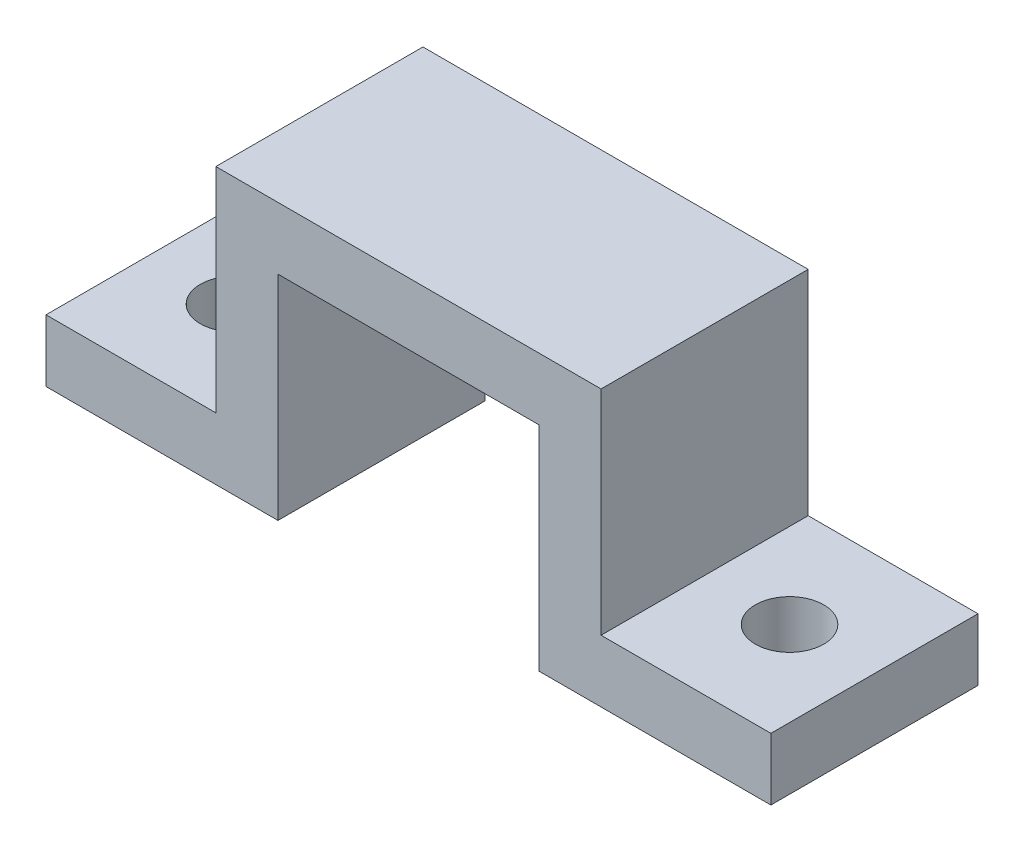
ISO-10303-21;
HEADER;
FILE_DESCRIPTION(('STEP AP214'),'2;1');
FILE_NAME('part.step','',(''),(''),'','','');
FILE_SCHEMA(('AUTOMOTIVE_DESIGN { 1 0 10303 214 1 1 1 1 }'));
ENDSEC;
DATA;
#1=APPLICATION_CONTEXT('core data for automotive mechanical design processes');
#2=APPLICATION_PROTOCOL_DEFINITION('international standard','automotive_design',2000,#1);
#3=PRODUCT_CONTEXT('',#1,'mechanical');
#4=PRODUCT('Part','Part','',(#3));
#5=PRODUCT_RELATED_PRODUCT_CATEGORY('part','',(#4));
#6=PRODUCT_DEFINITION_FORMATION('','',#4);
#7=PRODUCT_DEFINITION_CONTEXT('part definition',#1,'design');
#8=PRODUCT_DEFINITION('design','',#6,#7);
#9=PRODUCT_DEFINITION_SHAPE('','',#8);
#10=(LENGTH_UNIT() NAMED_UNIT(*) SI_UNIT(.MILLI.,.METRE.));
#11=(NAMED_UNIT(*) PLANE_ANGLE_UNIT() SI_UNIT($,.RADIAN.));
#12=(NAMED_UNIT(*) SI_UNIT($,.STERADIAN.) SOLID_ANGLE_UNIT());
#13=UNCERTAINTY_MEASURE_WITH_UNIT(LENGTH_MEASURE(1.E-05),#10,'distance_accuracy_value','');
#14=(GEOMETRIC_REPRESENTATION_CONTEXT(3) GLOBAL_UNCERTAINTY_ASSIGNED_CONTEXT((#13)) GLOBAL_UNIT_ASSIGNED_CONTEXT((#10,
#11,#12)) REPRESENTATION_CONTEXT('',''));
#15=CARTESIAN_POINT('',(0.,0.,0.));
#16=DIRECTION('',(0.,0.,1.));
#17=DIRECTION('',(1.,0.,0.));
#18=AXIS2_PLACEMENT_3D('',#15,#16,#17);
#19=CARTESIAN_POINT('',(0.,-5.15,10.));
#20=DIRECTION('',(0.,-1.,0.));
#21=DIRECTION('',(1.,0.,0.));
#22=AXIS2_PLACEMENT_3D('',#19,#20,#21);
#23=PLANE('',#22);
#24=CARTESIAN_POINT('',(13.4,-5.15,5.));
#25=DIRECTION('',(0.,-1.,0.));
#26=DIRECTION('',(1.,0.,0.));
#27=AXIS2_PLACEMENT_3D('',#24,#25,#26);
#28=CIRCLE('',#27,1.65);
#29=CARTESIAN_POINT('',(15.05,-5.15,5.));
#30=VERTEX_POINT('',#29);
#31=EDGE_CURVE('E251',#30,#30,#28,.F.);
#32=ORIENTED_EDGE('',*,*,#31,.T.);
#33=EDGE_LOOP('',(#32));
#34=FACE_BOUND('',#33,.T.);
#35=DIRECTION('',(-1.,0.,0.));
#36=VECTOR('',#35,1.);
#37=CARTESIAN_POINT('',(0.,-5.15,0.));
#38=LINE('',#37,#36);
#39=CARTESIAN_POINT('',(17.5,-5.15,0.));
#40=VERTEX_POINT('',#39);
#41=CARTESIAN_POINT('',(6.3,-5.15,0.));
#42=VERTEX_POINT('',#41);
#43=EDGE_CURVE('E155',#40,#42,#38,.T.);
#44=ORIENTED_EDGE('',*,*,#43,.F.);
#45=DIRECTION('',(0.,0.,-1.));
#46=VECTOR('',#45,1.);
#47=CARTESIAN_POINT('',(17.5,-5.15,10.));
#48=LINE('',#47,#46);
#49=CARTESIAN_POINT('',(17.5,-5.15,10.));
#50=VERTEX_POINT('',#49);
#51=EDGE_CURVE('E11',#50,#40,#48,.T.);
#52=ORIENTED_EDGE('',*,*,#51,.F.);
#53=DIRECTION('',(-1.,0.,0.));
#54=VECTOR('',#53,1.);
#55=CARTESIAN_POINT('',(0.,-5.15,10.));
#56=LINE('',#55,#54);
#57=CARTESIAN_POINT('',(6.3,-5.15,10.));
#58=VERTEX_POINT('',#57);
#59=EDGE_CURVE('E187',#50,#58,#56,.T.);
#60=ORIENTED_EDGE('',*,*,#59,.T.);
#61=DIRECTION('',(0.,0.,-1.));
#62=VECTOR('',#61,1.);
#63=CARTESIAN_POINT('',(6.3,-5.15,10.));
#64=LINE('',#63,#62);
#65=EDGE_CURVE('E99',#58,#42,#64,.T.);
#66=ORIENTED_EDGE('',*,*,#65,.T.);
#67=EDGE_LOOP('',(#44,#52,#60,#66));
#68=FACE_BOUND('',#67,.T.);
#69=ADVANCED_FACE('F37',(#34,#68),#23,.T.);
#70=CARTESIAN_POINT('',(17.5,0.,10.));
#71=DIRECTION('',(1.,0.,0.));
#72=DIRECTION('',(0.,0.,-1.));
#73=AXIS2_PLACEMENT_3D('',#70,#71,#72);
#74=PLANE('',#73);
#75=DIRECTION('',(0.,-1.,0.));
#76=VECTOR('',#75,1.);
#77=CARTESIAN_POINT('',(17.5,0.,0.));
#78=LINE('',#77,#76);
#79=CARTESIAN_POINT('',(17.5,-2.15,0.));
#80=VERTEX_POINT('',#79);
#81=EDGE_CURVE('E158',#80,#40,#78,.T.);
#82=ORIENTED_EDGE('',*,*,#81,.F.);
#83=DIRECTION('',(0.,0.,-1.));
#84=VECTOR('',#83,1.);
#85=CARTESIAN_POINT('',(17.5,-2.15,10.));
#86=LINE('',#85,#84);
#87=CARTESIAN_POINT('',(17.5,-2.15,10.));
#88=VERTEX_POINT('',#87);
#89=EDGE_CURVE('E45',#88,#80,#86,.T.);
#90=ORIENTED_EDGE('',*,*,#89,.F.);
#91=DIRECTION('',(0.,-1.,0.));
#92=VECTOR('',#91,1.);
#93=CARTESIAN_POINT('',(17.5,0.,10.));
#94=LINE('',#93,#92);
#95=EDGE_CURVE('E224',#88,#50,#94,.T.);
#96=ORIENTED_EDGE('',*,*,#95,.T.);
#97=ORIENTED_EDGE('',*,*,#51,.T.);
#98=EDGE_LOOP('',(#82,#90,#96,#97));
#99=FACE_BOUND('',#98,.T.);
#100=ADVANCED_FACE('F212',(#99),#74,.T.);
#101=CARTESIAN_POINT('',(0.,-2.15,10.));
#102=DIRECTION('',(0.,1.,0.));
#103=DIRECTION('',(0.,0.,1.));
#104=AXIS2_PLACEMENT_3D('',#101,#102,#103);
#105=PLANE('',#104);
#106=CARTESIAN_POINT('',(13.4,-2.15,5.));
#107=DIRECTION('',(0.,1.,0.));
#108=DIRECTION('',(0.,0.,1.));
#109=AXIS2_PLACEMENT_3D('',#106,#107,#108);
#110=CIRCLE('',#109,1.65);
#111=CARTESIAN_POINT('',(13.4,-2.15,6.65));
#112=VERTEX_POINT('',#111);
#113=EDGE_CURVE('E255',#112,#112,#110,.T.);
#114=ORIENTED_EDGE('',*,*,#113,.F.);
#115=EDGE_LOOP('',(#114));
#116=FACE_BOUND('',#115,.T.);
#117=DIRECTION('',(1.,0.,0.));
#118=VECTOR('',#117,1.);
#119=CARTESIAN_POINT('',(0.,-2.15,0.));
#120=LINE('',#119,#118);
#121=CARTESIAN_POINT('',(9.3,-2.15,0.));
#122=VERTEX_POINT('',#121);
#123=EDGE_CURVE('E162',#122,#80,#120,.T.);
#124=ORIENTED_EDGE('',*,*,#123,.F.);
#125=DIRECTION('',(0.,0.,-1.));
#126=VECTOR('',#125,1.);
#127=CARTESIAN_POINT('',(9.3,-2.15,10.));
#128=LINE('',#127,#126);
#129=CARTESIAN_POINT('',(9.3,-2.15,10.));
#130=VERTEX_POINT('',#129);
#131=EDGE_CURVE('E201',#130,#122,#128,.T.);
#132=ORIENTED_EDGE('',*,*,#131,.F.);
#133=DIRECTION('',(1.,0.,0.));
#134=VECTOR('',#133,1.);
#135=CARTESIAN_POINT('',(0.,-2.15,10.));
#136=LINE('',#135,#134);
#137=EDGE_CURVE('E208',#130,#88,#136,.T.);
#138=ORIENTED_EDGE('',*,*,#137,.T.);
#139=ORIENTED_EDGE('',*,*,#89,.T.);
#140=EDGE_LOOP('',(#124,#132,#138,#139));
#141=FACE_BOUND('',#140,.T.);
#142=ADVANCED_FACE('F206',(#116,#141),#105,.T.);
#143=CARTESIAN_POINT('',(9.3,0.,10.));
#144=DIRECTION('',(1.,0.,0.));
#145=DIRECTION('',(0.,0.,-1.));
#146=AXIS2_PLACEMENT_3D('',#143,#144,#145);
#147=PLANE('',#146);
#148=DIRECTION('',(0.,-1.,0.));
#149=VECTOR('',#148,1.);
#150=CARTESIAN_POINT('',(9.3,0.,0.));
#151=LINE('',#150,#149);
#152=CARTESIAN_POINT('',(9.3,8.15,0.));
#153=VERTEX_POINT('',#152);
#154=EDGE_CURVE('E165',#153,#122,#151,.T.);
#155=ORIENTED_EDGE('',*,*,#154,.F.);
#156=DIRECTION('',(0.,0.,-1.));
#157=VECTOR('',#156,1.);
#158=CARTESIAN_POINT('',(9.3,8.15,10.));
#159=LINE('',#158,#157);
#160=CARTESIAN_POINT('',(9.3,8.15,10.));
#161=VERTEX_POINT('',#160);
#162=EDGE_CURVE('E199',#161,#153,#159,.T.);
#163=ORIENTED_EDGE('',*,*,#162,.F.);
#164=DIRECTION('',(0.,-1.,0.));
#165=VECTOR('',#164,1.);
#166=CARTESIAN_POINT('',(9.3,0.,10.));
#167=LINE('',#166,#165);
#168=EDGE_CURVE('E221',#161,#130,#167,.T.);
#169=ORIENTED_EDGE('',*,*,#168,.T.);
#170=ORIENTED_EDGE('',*,*,#131,.T.);
#171=EDGE_LOOP('',(#155,#163,#169,#170));
#172=FACE_BOUND('',#171,.T.);
#173=ADVANCED_FACE('F218',(#172),#147,.T.);
#174=CARTESIAN_POINT('',(0.,8.15,10.));
#175=DIRECTION('',(0.,1.,0.));
#176=DIRECTION('',(0.,0.,1.));
#177=AXIS2_PLACEMENT_3D('',#174,#175,#176);
#178=PLANE('',#177);
#179=DIRECTION('',(1.,0.,0.));
#180=VECTOR('',#179,1.);
#181=CARTESIAN_POINT('',(0.,8.15,0.));
#182=LINE('',#181,#180);
#183=CARTESIAN_POINT('',(-9.3,8.15,0.));
#184=VERTEX_POINT('',#183);
#185=EDGE_CURVE('E168',#184,#153,#182,.T.);
#186=ORIENTED_EDGE('',*,*,#185,.F.);
#187=DIRECTION('',(0.,0.,-1.));
#188=VECTOR('',#187,1.);
#189=CARTESIAN_POINT('',(-9.3,8.15,10.));
#190=LINE('',#189,#188);
#191=CARTESIAN_POINT('',(-9.3,8.15,10.));
#192=VERTEX_POINT('',#191);
#193=EDGE_CURVE('E197',#192,#184,#190,.T.);
#194=ORIENTED_EDGE('',*,*,#193,.F.);
#195=DIRECTION('',(1.,0.,0.));
#196=VECTOR('',#195,1.);
#197=CARTESIAN_POINT('',(0.,8.15,10.));
#198=LINE('',#197,#196);
#199=EDGE_CURVE('E226',#192,#161,#198,.T.);
#200=ORIENTED_EDGE('',*,*,#199,.T.);
#201=ORIENTED_EDGE('',*,*,#162,.T.);
#202=EDGE_LOOP('',(#186,#194,#200,#201));
#203=FACE_BOUND('',#202,.T.);
#204=ADVANCED_FACE('F274',(#203),#178,.T.);
#205=CARTESIAN_POINT('',(-9.3,0.,10.));
#206=DIRECTION('',(-1.,0.,0.));
#207=DIRECTION('',(0.,0.,1.));
#208=AXIS2_PLACEMENT_3D('',#205,#206,#207);
#209=PLANE('',#208);
#210=DIRECTION('',(0.,1.,0.));
#211=VECTOR('',#210,1.);
#212=CARTESIAN_POINT('',(-9.3,0.,0.));
#213=LINE('',#212,#211);
#214=CARTESIAN_POINT('',(-9.3,-2.15,0.));
#215=VERTEX_POINT('',#214);
#216=EDGE_CURVE('E171',#215,#184,#213,.T.);
#217=ORIENTED_EDGE('',*,*,#216,.F.);
#218=DIRECTION('',(0.,0.,-1.));
#219=VECTOR('',#218,1.);
#220=CARTESIAN_POINT('',(-9.3,-2.15,10.));
#221=LINE('',#220,#219);
#222=CARTESIAN_POINT('',(-9.3,-2.15,10.));
#223=VERTEX_POINT('',#222);
#224=EDGE_CURVE('E195',#223,#215,#221,.T.);
#225=ORIENTED_EDGE('',*,*,#224,.F.);
#226=DIRECTION('',(0.,1.,0.));
#227=VECTOR('',#226,1.);
#228=CARTESIAN_POINT('',(-9.3,0.,10.));
#229=LINE('',#228,#227);
#230=EDGE_CURVE('E232',#223,#192,#229,.T.);
#231=ORIENTED_EDGE('',*,*,#230,.T.);
#232=ORIENTED_EDGE('',*,*,#193,.T.);
#233=EDGE_LOOP('',(#217,#225,#231,#232));
#234=FACE_BOUND('',#233,.T.);
#235=ADVANCED_FACE('F269',(#234),#209,.T.);
#236=CARTESIAN_POINT('',(0.,-2.15,10.));
#237=DIRECTION('',(0.,1.,0.));
#238=DIRECTION('',(0.,0.,1.));
#239=AXIS2_PLACEMENT_3D('',#236,#237,#238);
#240=PLANE('',#239);
#241=CARTESIAN_POINT('',(-13.4,-2.15,5.));
#242=DIRECTION('',(0.,1.,0.));
#243=DIRECTION('',(0.,0.,1.));
#244=AXIS2_PLACEMENT_3D('',#241,#242,#243);
#245=CIRCLE('',#244,1.65);
#246=CARTESIAN_POINT('',(-13.4,-2.15,6.65));
#247=VERTEX_POINT('',#246);
#248=EDGE_CURVE('E254',#247,#247,#245,.T.);
#249=ORIENTED_EDGE('',*,*,#248,.F.);
#250=EDGE_LOOP('',(#249));
#251=FACE_BOUND('',#250,.T.);
#252=DIRECTION('',(1.,0.,0.));
#253=VECTOR('',#252,1.);
#254=CARTESIAN_POINT('',(0.,-2.15,0.));
#255=LINE('',#254,#253);
#256=CARTESIAN_POINT('',(-17.5,-2.15,0.));
#257=VERTEX_POINT('',#256);
#258=EDGE_CURVE('E174',#257,#215,#255,.T.);
#259=ORIENTED_EDGE('',*,*,#258,.F.);
#260=DIRECTION('',(0.,0.,-1.));
#261=VECTOR('',#260,1.);
#262=CARTESIAN_POINT('',(-17.5,-2.15,10.));
#263=LINE('',#262,#261);
#264=CARTESIAN_POINT('',(-17.5,-2.15,10.));
#265=VERTEX_POINT('',#264);
#266=EDGE_CURVE('E193',#265,#257,#263,.T.);
#267=ORIENTED_EDGE('',*,*,#266,.F.);
#268=DIRECTION('',(1.,0.,0.));
#269=VECTOR('',#268,1.);
#270=CARTESIAN_POINT('',(0.,-2.15,10.));
#271=LINE('',#270,#269);
#272=EDGE_CURVE('E235',#265,#223,#271,.T.);
#273=ORIENTED_EDGE('',*,*,#272,.T.);
#274=ORIENTED_EDGE('',*,*,#224,.T.);
#275=EDGE_LOOP('',(#259,#267,#273,#274));
#276=FACE_BOUND('',#275,.T.);
#277=ADVANCED_FACE('F266',(#251,#276),#240,.T.);
#278=CARTESIAN_POINT('',(-17.5,0.,10.));
#279=DIRECTION('',(-1.,0.,0.));
#280=DIRECTION('',(0.,0.,1.));
#281=AXIS2_PLACEMENT_3D('',#278,#279,#280);
#282=PLANE('',#281);
#283=DIRECTION('',(0.,1.,0.));
#284=VECTOR('',#283,1.);
#285=CARTESIAN_POINT('',(-17.5,0.,0.));
#286=LINE('',#285,#284);
#287=CARTESIAN_POINT('',(-17.5,-5.15,0.));
#288=VERTEX_POINT('',#287);
#289=EDGE_CURVE('E177',#288,#257,#286,.T.);
#290=ORIENTED_EDGE('',*,*,#289,.F.);
#291=DIRECTION('',(0.,0.,-1.));
#292=VECTOR('',#291,1.);
#293=CARTESIAN_POINT('',(-17.5,-5.15,10.));
#294=LINE('',#293,#292);
#295=CARTESIAN_POINT('',(-17.5,-5.15,10.));
#296=VERTEX_POINT('',#295);
#297=EDGE_CURVE('E191',#296,#288,#294,.T.);
#298=ORIENTED_EDGE('',*,*,#297,.F.);
#299=DIRECTION('',(0.,1.,0.));
#300=VECTOR('',#299,1.);
#301=CARTESIAN_POINT('',(-17.5,0.,10.));
#302=LINE('',#301,#300);
#303=EDGE_CURVE('E150',#296,#265,#302,.T.);
#304=ORIENTED_EDGE('',*,*,#303,.T.);
#305=ORIENTED_EDGE('',*,*,#266,.T.);
#306=EDGE_LOOP('',(#290,#298,#304,#305));
#307=FACE_BOUND('',#306,.T.);
#308=ADVANCED_FACE('F240',(#307),#282,.T.);
#309=CARTESIAN_POINT('',(0.,-5.15,10.));
#310=DIRECTION('',(0.,-1.,0.));
#311=DIRECTION('',(1.,0.,0.));
#312=AXIS2_PLACEMENT_3D('',#309,#310,#311);
#313=PLANE('',#312);
#314=CARTESIAN_POINT('',(-13.4,-5.15,5.));
#315=DIRECTION('',(0.,-1.,0.));
#316=DIRECTION('',(1.,0.,0.));
#317=AXIS2_PLACEMENT_3D('',#314,#315,#316);
#318=CIRCLE('',#317,1.65);
#319=CARTESIAN_POINT('',(-11.75,-5.15,5.));
#320=VERTEX_POINT('',#319);
#321=EDGE_CURVE('E159',#320,#320,#318,.F.);
#322=ORIENTED_EDGE('',*,*,#321,.T.);
#323=EDGE_LOOP('',(#322));
#324=FACE_BOUND('',#323,.T.);
#325=DIRECTION('',(-1.,0.,0.));
#326=VECTOR('',#325,1.);
#327=CARTESIAN_POINT('',(0.,-5.15,0.));
#328=LINE('',#327,#326);
#329=CARTESIAN_POINT('',(-6.3,-5.15,0.));
#330=VERTEX_POINT('',#329);
#331=EDGE_CURVE('E180',#330,#288,#328,.T.);
#332=ORIENTED_EDGE('',*,*,#331,.F.);
#333=DIRECTION('',(0.,0.,-1.));
#334=VECTOR('',#333,1.);
#335=CARTESIAN_POINT('',(-6.3,-5.15,10.));
#336=LINE('',#335,#334);
#337=CARTESIAN_POINT('',(-6.3,-5.15,10.));
#338=VERTEX_POINT('',#337);
#339=EDGE_CURVE('E138',#338,#330,#336,.T.);
#340=ORIENTED_EDGE('',*,*,#339,.F.);
#341=DIRECTION('',(-1.,0.,0.));
#342=VECTOR('',#341,1.);
#343=CARTESIAN_POINT('',(0.,-5.15,10.));
#344=LINE('',#343,#342);
#345=EDGE_CURVE('E148',#338,#296,#344,.T.);
#346=ORIENTED_EDGE('',*,*,#345,.T.);
#347=ORIENTED_EDGE('',*,*,#297,.T.);
#348=EDGE_LOOP('',(#332,#340,#346,#347));
#349=FACE_BOUND('',#348,.T.);
#350=ADVANCED_FACE('F246',(#324,#349),#313,.T.);
#351=CARTESIAN_POINT('',(-6.3,0.,10.));
#352=DIRECTION('',(1.,0.,0.));
#353=DIRECTION('',(0.,1.,0.));
#354=AXIS2_PLACEMENT_3D('',#351,#352,#353);
#355=PLANE('',#354);
#356=DIRECTION('',(0.,-1.,0.));
#357=VECTOR('',#356,1.);
#358=CARTESIAN_POINT('',(-6.3,0.,0.));
#359=LINE('',#358,#357);
#360=CARTESIAN_POINT('',(-6.3,5.15,0.));
#361=VERTEX_POINT('',#360);
#362=EDGE_CURVE('E137',#361,#330,#359,.T.);
#363=ORIENTED_EDGE('',*,*,#362,.F.);
#364=DIRECTION('',(0.,0.,-1.));
#365=VECTOR('',#364,1.);
#366=CARTESIAN_POINT('',(-6.3,5.15,10.));
#367=LINE('',#366,#365);
#368=CARTESIAN_POINT('',(-6.3,5.15,10.));
#369=VERTEX_POINT('',#368);
#370=EDGE_CURVE('E131',#369,#361,#367,.T.);
#371=ORIENTED_EDGE('',*,*,#370,.F.);
#372=DIRECTION('',(0.,-1.,0.));
#373=VECTOR('',#372,1.);
#374=CARTESIAN_POINT('',(-6.3,0.,10.));
#375=LINE('',#374,#373);
#376=EDGE_CURVE('E135',#369,#338,#375,.T.);
#377=ORIENTED_EDGE('',*,*,#376,.T.);
#378=ORIENTED_EDGE('',*,*,#339,.T.);
#379=EDGE_LOOP('',(#363,#371,#377,#378));
#380=FACE_BOUND('',#379,.T.);
#381=ADVANCED_FACE('F133',(#380),#355,.T.);
#382=CARTESIAN_POINT('',(0.,5.15,10.));
#383=DIRECTION('',(0.,1.,0.));
#384=DIRECTION('',(0.,0.,1.));
#385=AXIS2_PLACEMENT_3D('',#382,#383,#384);
#386=PLANE('',#385);
#387=DIRECTION('',(1.,0.,0.));
#388=VECTOR('',#387,1.);
#389=CARTESIAN_POINT('',(0.,5.15,0.));
#390=LINE('',#389,#388);
#391=CARTESIAN_POINT('',(6.3,5.15,0.));
#392=VERTEX_POINT('',#391);
#393=EDGE_CURVE('E92',#361,#392,#390,.T.);
#394=ORIENTED_EDGE('',*,*,#393,.T.);
#395=DIRECTION('',(0.,0.,-1.));
#396=VECTOR('',#395,1.);
#397=CARTESIAN_POINT('',(6.3,5.15,10.));
#398=LINE('',#397,#396);
#399=CARTESIAN_POINT('',(6.3,5.15,10.));
#400=VERTEX_POINT('',#399);
#401=EDGE_CURVE('E139',#400,#392,#398,.T.);
#402=ORIENTED_EDGE('',*,*,#401,.F.);
#403=DIRECTION('',(1.,0.,0.));
#404=VECTOR('',#403,1.);
#405=CARTESIAN_POINT('',(0.,5.15,10.));
#406=LINE('',#405,#404);
#407=EDGE_CURVE('E141',#369,#400,#406,.T.);
#408=ORIENTED_EDGE('',*,*,#407,.F.);
#409=ORIENTED_EDGE('',*,*,#370,.T.);
#410=EDGE_LOOP('',(#394,#402,#408,#409));
#411=FACE_BOUND('',#410,.T.);
#412=ADVANCED_FACE('F142',(#411),#386,.F.);
#413=CARTESIAN_POINT('',(6.3,0.,10.));
#414=DIRECTION('',(1.,0.,0.));
#415=DIRECTION('',(0.,1.,0.));
#416=AXIS2_PLACEMENT_3D('',#413,#414,#415);
#417=PLANE('',#416);
#418=DIRECTION('',(0.,-1.,0.));
#419=VECTOR('',#418,1.);
#420=CARTESIAN_POINT('',(6.3,0.,0.));
#421=LINE('',#420,#419);
#422=EDGE_CURVE('E185',#392,#42,#421,.T.);
#423=ORIENTED_EDGE('',*,*,#422,.T.);
#424=ORIENTED_EDGE('',*,*,#65,.F.);
#425=DIRECTION('',(0.,-1.,0.));
#426=VECTOR('',#425,1.);
#427=CARTESIAN_POINT('',(6.3,0.,10.));
#428=LINE('',#427,#426);
#429=EDGE_CURVE('E53',#400,#58,#428,.T.);
#430=ORIENTED_EDGE('',*,*,#429,.F.);
#431=ORIENTED_EDGE('',*,*,#401,.T.);
#432=EDGE_LOOP('',(#423,#424,#430,#431));
#433=FACE_BOUND('',#432,.T.);
#434=ADVANCED_FACE('F249',(#433),#417,.F.);
#435=CARTESIAN_POINT('',(0.,0.,10.));
#436=DIRECTION('',(0.,0.,1.));
#437=DIRECTION('',(1.,0.,0.));
#438=AXIS2_PLACEMENT_3D('',#435,#436,#437);
#439=PLANE('',#438);
#440=ORIENTED_EDGE('',*,*,#59,.F.);
#441=ORIENTED_EDGE('',*,*,#95,.F.);
#442=ORIENTED_EDGE('',*,*,#137,.F.);
#443=ORIENTED_EDGE('',*,*,#168,.F.);
#444=ORIENTED_EDGE('',*,*,#199,.F.);
#445=ORIENTED_EDGE('',*,*,#230,.F.);
#446=ORIENTED_EDGE('',*,*,#272,.F.);
#447=ORIENTED_EDGE('',*,*,#303,.F.);
#448=ORIENTED_EDGE('',*,*,#345,.F.);
#449=ORIENTED_EDGE('',*,*,#376,.F.);
#450=ORIENTED_EDGE('',*,*,#407,.T.);
#451=ORIENTED_EDGE('',*,*,#429,.T.);
#452=EDGE_LOOP('',(#440,#441,#442,#443,#444,#445,#446,#447,#448,#449,#450,#451));
#453=FACE_BOUND('',#452,.T.);
#454=ADVANCED_FACE('F145',(#453),#439,.T.);
#455=CARTESIAN_POINT('',(0.,0.,0.));
#456=DIRECTION('',(0.,0.,1.));
#457=DIRECTION('',(1.,0.,0.));
#458=AXIS2_PLACEMENT_3D('',#455,#456,#457);
#459=PLANE('',#458);
#460=ORIENTED_EDGE('',*,*,#43,.T.);
#461=ORIENTED_EDGE('',*,*,#422,.F.);
#462=ORIENTED_EDGE('',*,*,#393,.F.);
#463=ORIENTED_EDGE('',*,*,#362,.T.);
#464=ORIENTED_EDGE('',*,*,#331,.T.);
#465=ORIENTED_EDGE('',*,*,#289,.T.);
#466=ORIENTED_EDGE('',*,*,#258,.T.);
#467=ORIENTED_EDGE('',*,*,#216,.T.);
#468=ORIENTED_EDGE('',*,*,#185,.T.);
#469=ORIENTED_EDGE('',*,*,#154,.T.);
#470=ORIENTED_EDGE('',*,*,#123,.T.);
#471=ORIENTED_EDGE('',*,*,#81,.T.);
#472=EDGE_LOOP('',(#460,#461,#462,#463,#464,#465,#466,#467,#468,#469,#470,#471));
#473=FACE_BOUND('',#472,.T.);
#474=ADVANCED_FACE('F214',(#473),#459,.F.);
#475=CARTESIAN_POINT('',(-13.4,-9.81690475583122,5.));
#476=DIRECTION('',(0.,1.,0.));
#477=DIRECTION('',(0.,0.,1.));
#478=AXIS2_PLACEMENT_3D('',#475,#476,#477);
#479=CYLINDRICAL_SURFACE('',#478,1.65);
#480=ORIENTED_EDGE('',*,*,#248,.T.);
#481=EDGE_LOOP('',(#480));
#482=FACE_BOUND('',#481,.T.);
#483=ORIENTED_EDGE('',*,*,#321,.F.);
#484=EDGE_LOOP('',(#483));
#485=FACE_BOUND('',#484,.T.);
#486=ADVANCED_FACE('F263',(#482,#485),#479,.F.);
#487=CARTESIAN_POINT('',(13.4,-9.81690475583122,5.));
#488=DIRECTION('',(0.,1.,0.));
#489=DIRECTION('',(0.,0.,1.));
#490=AXIS2_PLACEMENT_3D('',#487,#488,#489);
#491=CYLINDRICAL_SURFACE('',#490,1.65);
#492=ORIENTED_EDGE('',*,*,#113,.T.);
#493=EDGE_LOOP('',(#492));
#494=FACE_BOUND('',#493,.T.);
#495=ORIENTED_EDGE('',*,*,#31,.F.);
#496=EDGE_LOOP('',(#495));
#497=FACE_BOUND('',#496,.T.);
#498=ADVANCED_FACE('F290',(#494,#497),#491,.F.);
#499=CLOSED_SHELL('',(#69,#100,#142,#173,#204,#235,#277,#308,#350,#381,#412,#434,#454,#474,#486,#498));
#500=MANIFOLD_SOLID_BREP('B2',#499);
#501=ADVANCED_BREP_SHAPE_REPRESENTATION('',(#18,#500),#14);
#502=SHAPE_DEFINITION_REPRESENTATION(#9,#501);
ENDSEC;
END-ISO-10303-21;
